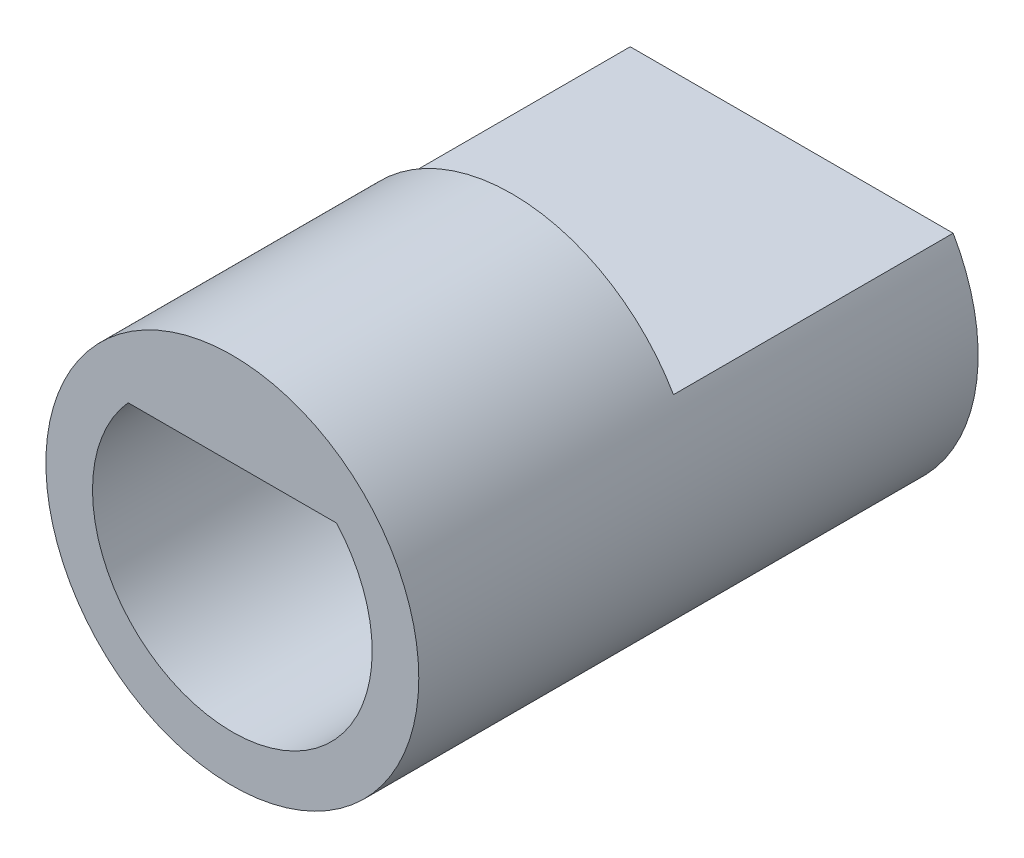
ISO-10303-21;
HEADER;
FILE_DESCRIPTION(('STEP AP214'),'2;1');
FILE_NAME('part.step','',(''),(''),'','','');
FILE_SCHEMA(('AUTOMOTIVE_DESIGN { 1 0 10303 214 1 1 1 1 }'));
ENDSEC;
DATA;
#1=APPLICATION_CONTEXT('core data for automotive mechanical design processes');
#2=APPLICATION_PROTOCOL_DEFINITION('international standard','automotive_design',2000,#1);
#3=PRODUCT_CONTEXT('',#1,'mechanical');
#4=PRODUCT('Part','Part','',(#3));
#5=PRODUCT_RELATED_PRODUCT_CATEGORY('part','',(#4));
#6=PRODUCT_DEFINITION_FORMATION('','',#4);
#7=PRODUCT_DEFINITION_CONTEXT('part definition',#1,'design');
#8=PRODUCT_DEFINITION('design','',#6,#7);
#9=PRODUCT_DEFINITION_SHAPE('','',#8);
#10=(LENGTH_UNIT() NAMED_UNIT(*) SI_UNIT(.MILLI.,.METRE.));
#11=(NAMED_UNIT(*) PLANE_ANGLE_UNIT() SI_UNIT($,.RADIAN.));
#12=(NAMED_UNIT(*) SI_UNIT($,.STERADIAN.) SOLID_ANGLE_UNIT());
#13=UNCERTAINTY_MEASURE_WITH_UNIT(LENGTH_MEASURE(1.E-05),#10,'distance_accuracy_value','');
#14=(GEOMETRIC_REPRESENTATION_CONTEXT(3) GLOBAL_UNCERTAINTY_ASSIGNED_CONTEXT((#13)) GLOBAL_UNIT_ASSIGNED_CONTEXT((#10,
#11,#12)) REPRESENTATION_CONTEXT('',''));
#15=CARTESIAN_POINT('',(0.,0.,0.));
#16=DIRECTION('',(0.,0.,1.));
#17=DIRECTION('',(1.,0.,0.));
#18=AXIS2_PLACEMENT_3D('',#15,#16,#17);
#19=CARTESIAN_POINT('',(0.,0.,0.));
#20=DIRECTION('',(0.,0.,1.));
#21=DIRECTION('',(1.,0.,0.));
#22=AXIS2_PLACEMENT_3D('',#19,#20,#21);
#23=PLANE('',#22);
#24=DIRECTION('',(1.,0.,0.));
#25=VECTOR('',#24,1.);
#26=CARTESIAN_POINT('',(0.,1.,0.));
#27=LINE('',#26,#25);
#28=CARTESIAN_POINT('',(-1.73205080756888,1.,0.));
#29=VERTEX_POINT('',#28);
#30=CARTESIAN_POINT('',(1.73205080756888,1.,0.));
#31=VERTEX_POINT('',#30);
#32=EDGE_CURVE('E62',#29,#31,#27,.T.);
#33=ORIENTED_EDGE('',*,*,#32,.F.);
#34=CARTESIAN_POINT('',(0.,0.,0.));
#35=DIRECTION('',(0.,0.,1.));
#36=DIRECTION('',(1.,0.,0.));
#37=AXIS2_PLACEMENT_3D('',#34,#35,#36);
#38=CIRCLE('',#37,2.);
#39=EDGE_CURVE('E44',#31,#29,#38,.T.);
#40=ORIENTED_EDGE('',*,*,#39,.F.);
#41=EDGE_LOOP('',(#33,#40));
#42=FACE_BOUND('',#41,.T.);
#43=ADVANCED_FACE('F40',(#42),#23,.F.);
#44=CARTESIAN_POINT('',(0.,0.,3.));
#45=DIRECTION('',(0.,0.,-1.));
#46=DIRECTION('',(-1.,0.,0.));
#47=AXIS2_PLACEMENT_3D('',#44,#45,#46);
#48=CYLINDRICAL_SURFACE('',#47,2.);
#49=CARTESIAN_POINT('',(0.,0.,3.));
#50=DIRECTION('',(0.,0.,1.));
#51=DIRECTION('',(1.,0.,0.));
#52=AXIS2_PLACEMENT_3D('',#49,#50,#51);
#53=CIRCLE('',#52,2.);
#54=CARTESIAN_POINT('',(2.,0.,3.));
#55=VERTEX_POINT('',#54);
#56=EDGE_CURVE('E12',#55,#55,#53,.T.);
#57=ORIENTED_EDGE('',*,*,#56,.F.);
#58=EDGE_LOOP('',(#57));
#59=FACE_BOUND('',#58,.T.);
#60=ORIENTED_EDGE('',*,*,#39,.T.);
#61=DIRECTION('',(0.,0.,1.));
#62=VECTOR('',#61,1.);
#63=CARTESIAN_POINT('',(-1.73205080756888,1.,-3.));
#64=LINE('',#63,#62);
#65=CARTESIAN_POINT('',(-1.73205080756888,1.,-3.));
#66=VERTEX_POINT('',#65);
#67=EDGE_CURVE('E110',#66,#29,#64,.T.);
#68=ORIENTED_EDGE('',*,*,#67,.F.);
#69=CARTESIAN_POINT('',(0.,0.,-3.));
#70=DIRECTION('',(0.,0.,-1.));
#71=DIRECTION('',(-1.,0.,0.));
#72=AXIS2_PLACEMENT_3D('',#69,#70,#71);
#73=CIRCLE('',#72,2.);
#74=CARTESIAN_POINT('',(1.73205080756888,1.,-3.));
#75=VERTEX_POINT('',#74);
#76=EDGE_CURVE('E101',#75,#66,#73,.T.);
#77=ORIENTED_EDGE('',*,*,#76,.F.);
#78=DIRECTION('',(0.,0.,1.));
#79=VECTOR('',#78,1.);
#80=CARTESIAN_POINT('',(1.73205080756888,1.,-3.));
#81=LINE('',#80,#79);
#82=EDGE_CURVE('E106',#75,#31,#81,.T.);
#83=ORIENTED_EDGE('',*,*,#82,.T.);
#84=EDGE_LOOP('',(#60,#68,#77,#83));
#85=FACE_BOUND('',#84,.T.);
#86=ADVANCED_FACE('F42',(#59,#85),#48,.T.);
#87=CARTESIAN_POINT('',(0.,0.,3.));
#88=DIRECTION('',(0.,0.,1.));
#89=DIRECTION('',(1.,0.,0.));
#90=AXIS2_PLACEMENT_3D('',#87,#88,#89);
#91=PLANE('',#90);
#92=DIRECTION('',(-1.,0.,0.));
#93=VECTOR('',#92,1.);
#94=CARTESIAN_POINT('',(0.,1.,3.));
#95=LINE('',#94,#93);
#96=CARTESIAN_POINT('',(1.1180339887499,1.,3.));
#97=VERTEX_POINT('',#96);
#98=CARTESIAN_POINT('',(-1.1180339887499,1.,3.));
#99=VERTEX_POINT('',#98);
#100=EDGE_CURVE('E55',#97,#99,#95,.T.);
#101=ORIENTED_EDGE('',*,*,#100,.F.);
#102=CARTESIAN_POINT('',(0.,0.,3.));
#103=DIRECTION('',(0.,0.,1.));
#104=DIRECTION('',(1.,0.,0.));
#105=AXIS2_PLACEMENT_3D('',#102,#103,#104);
#106=CIRCLE('',#105,1.5);
#107=EDGE_CURVE('E93',#99,#97,#106,.T.);
#108=ORIENTED_EDGE('',*,*,#107,.F.);
#109=EDGE_LOOP('',(#101,#108));
#110=FACE_BOUND('',#109,.T.);
#111=ORIENTED_EDGE('',*,*,#56,.T.);
#112=EDGE_LOOP('',(#111));
#113=FACE_BOUND('',#112,.T.);
#114=ADVANCED_FACE('F127',(#110,#113),#91,.T.);
#115=CARTESIAN_POINT('',(0.,1.,-3.));
#116=DIRECTION('',(0.,-1.,0.));
#117=DIRECTION('',(0.,0.,-1.));
#118=AXIS2_PLACEMENT_3D('',#115,#116,#117);
#119=PLANE('',#118);
#120=ORIENTED_EDGE('',*,*,#32,.T.);
#121=ORIENTED_EDGE('',*,*,#82,.F.);
#122=DIRECTION('',(1.,0.,0.));
#123=VECTOR('',#122,1.);
#124=CARTESIAN_POINT('',(0.,1.,-3.));
#125=LINE('',#124,#123);
#126=EDGE_CURVE('E104',#66,#75,#125,.T.);
#127=ORIENTED_EDGE('',*,*,#126,.F.);
#128=ORIENTED_EDGE('',*,*,#67,.T.);
#129=EDGE_LOOP('',(#120,#121,#127,#128));
#130=FACE_BOUND('',#129,.T.);
#131=ADVANCED_FACE('F117',(#130),#119,.F.);
#132=CARTESIAN_POINT('',(0.,0.,-3.));
#133=DIRECTION('',(0.,0.,-1.));
#134=DIRECTION('',(-1.,0.,0.));
#135=AXIS2_PLACEMENT_3D('',#132,#133,#134);
#136=PLANE('',#135);
#137=ORIENTED_EDGE('',*,*,#76,.T.);
#138=ORIENTED_EDGE('',*,*,#126,.T.);
#139=EDGE_LOOP('',(#137,#138));
#140=FACE_BOUND('',#139,.T.);
#141=ADVANCED_FACE('F119',(#140),#136,.T.);
#142=CARTESIAN_POINT('',(0.,1.,0.5));
#143=DIRECTION('',(0.,1.,0.));
#144=DIRECTION('',(-1.,0.,0.));
#145=AXIS2_PLACEMENT_3D('',#142,#143,#144);
#146=PLANE('',#145);
#147=ORIENTED_EDGE('',*,*,#100,.T.);
#148=DIRECTION('',(0.,0.,1.));
#149=VECTOR('',#148,1.);
#150=CARTESIAN_POINT('',(-1.1180339887499,1.,0.5));
#151=LINE('',#150,#149);
#152=CARTESIAN_POINT('',(-1.1180339887499,1.,0.5));
#153=VERTEX_POINT('',#152);
#154=EDGE_CURVE('E79',#153,#99,#151,.T.);
#155=ORIENTED_EDGE('',*,*,#154,.F.);
#156=DIRECTION('',(-1.,0.,0.));
#157=VECTOR('',#156,1.);
#158=CARTESIAN_POINT('',(0.,1.,0.5));
#159=LINE('',#158,#157);
#160=CARTESIAN_POINT('',(1.1180339887499,1.,0.5));
#161=VERTEX_POINT('',#160);
#162=EDGE_CURVE('E82',#161,#153,#159,.T.);
#163=ORIENTED_EDGE('',*,*,#162,.F.);
#164=DIRECTION('',(0.,0.,1.));
#165=VECTOR('',#164,1.);
#166=CARTESIAN_POINT('',(1.1180339887499,1.,0.5));
#167=LINE('',#166,#165);
#168=EDGE_CURVE('E88',#161,#97,#167,.T.);
#169=ORIENTED_EDGE('',*,*,#168,.T.);
#170=EDGE_LOOP('',(#147,#155,#163,#169));
#171=FACE_BOUND('',#170,.T.);
#172=ADVANCED_FACE('F81',(#171),#146,.F.);
#173=CARTESIAN_POINT('',(0.,0.,0.5));
#174=DIRECTION('',(0.,0.,1.));
#175=DIRECTION('',(1.,0.,0.));
#176=AXIS2_PLACEMENT_3D('',#173,#174,#175);
#177=CYLINDRICAL_SURFACE('',#176,1.5);
#178=ORIENTED_EDGE('',*,*,#107,.T.);
#179=ORIENTED_EDGE('',*,*,#168,.F.);
#180=CARTESIAN_POINT('',(0.,0.,0.5));
#181=DIRECTION('',(0.,0.,1.));
#182=DIRECTION('',(1.,0.,0.));
#183=AXIS2_PLACEMENT_3D('',#180,#181,#182);
#184=CIRCLE('',#183,1.5);
#185=EDGE_CURVE('E89',#153,#161,#184,.T.);
#186=ORIENTED_EDGE('',*,*,#185,.F.);
#187=ORIENTED_EDGE('',*,*,#154,.T.);
#188=EDGE_LOOP('',(#178,#179,#186,#187));
#189=FACE_BOUND('',#188,.T.);
#190=ADVANCED_FACE('F95',(#189),#177,.F.);
#191=CARTESIAN_POINT('',(0.,0.,0.5));
#192=DIRECTION('',(0.,0.,1.));
#193=DIRECTION('',(1.,0.,0.));
#194=AXIS2_PLACEMENT_3D('',#191,#192,#193);
#195=PLANE('',#194);
#196=ORIENTED_EDGE('',*,*,#162,.T.);
#197=ORIENTED_EDGE('',*,*,#185,.T.);
#198=EDGE_LOOP('',(#196,#197));
#199=FACE_BOUND('',#198,.T.);
#200=ADVANCED_FACE('F92',(#199),#195,.T.);
#201=CLOSED_SHELL('',(#43,#86,#114,#131,#141,#172,#190,#200));
#202=MANIFOLD_SOLID_BREP('B2',#201);
#203=ADVANCED_BREP_SHAPE_REPRESENTATION('',(#18,#202),#14);
#204=SHAPE_DEFINITION_REPRESENTATION(#9,#203);
ENDSEC;
END-ISO-10303-21;
